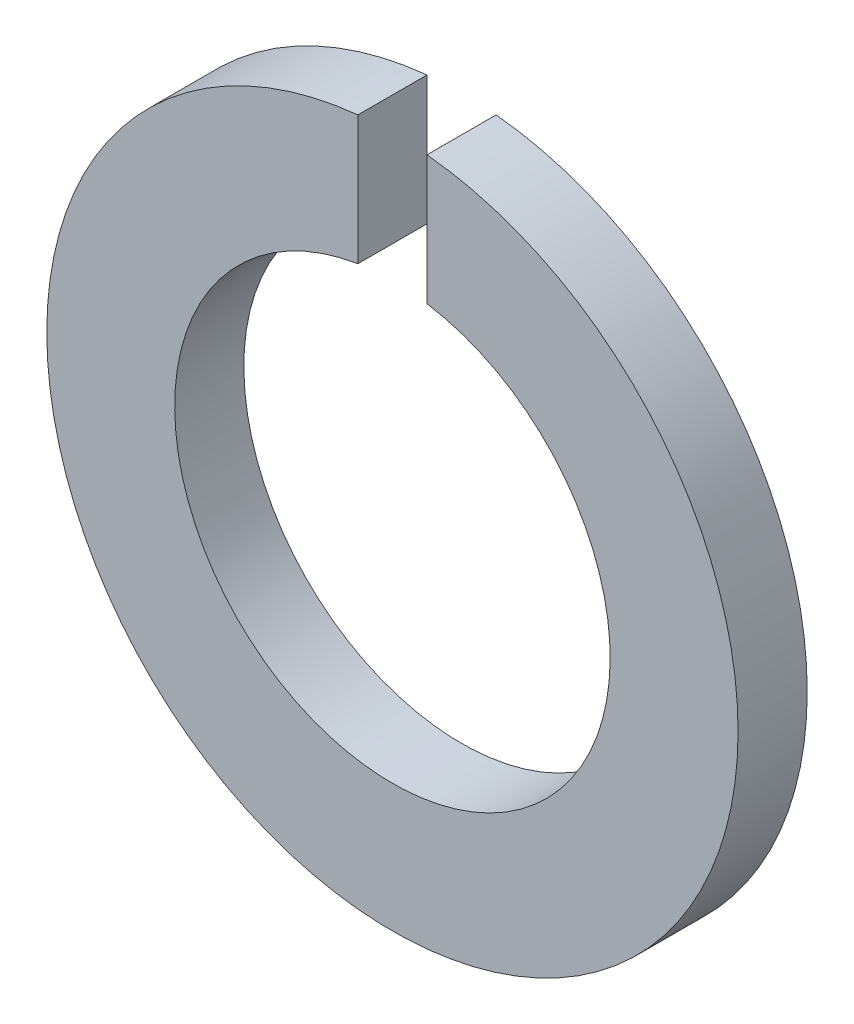
ISO-10303-21;
HEADER;
FILE_DESCRIPTION(('STEP AP214'),'2;1');
FILE_NAME('part.step','',(''),(''),'','','');
FILE_SCHEMA(('AUTOMOTIVE_DESIGN { 1 0 10303 214 1 1 1 1 }'));
ENDSEC;
DATA;
#1=APPLICATION_CONTEXT('core data for automotive mechanical design processes');
#2=APPLICATION_PROTOCOL_DEFINITION('international standard','automotive_design',2000,#1);
#3=PRODUCT_CONTEXT('',#1,'mechanical');
#4=PRODUCT('Part','Part','',(#3));
#5=PRODUCT_RELATED_PRODUCT_CATEGORY('part','',(#4));
#6=PRODUCT_DEFINITION_FORMATION('','',#4);
#7=PRODUCT_DEFINITION_CONTEXT('part definition',#1,'design');
#8=PRODUCT_DEFINITION('design','',#6,#7);
#9=PRODUCT_DEFINITION_SHAPE('','',#8);
#10=(LENGTH_UNIT() NAMED_UNIT(*) SI_UNIT(.MILLI.,.METRE.));
#11=(NAMED_UNIT(*) PLANE_ANGLE_UNIT() SI_UNIT($,.RADIAN.));
#12=(NAMED_UNIT(*) SI_UNIT($,.STERADIAN.) SOLID_ANGLE_UNIT());
#13=UNCERTAINTY_MEASURE_WITH_UNIT(LENGTH_MEASURE(1.E-05),#10,'distance_accuracy_value','');
#14=(GEOMETRIC_REPRESENTATION_CONTEXT(3) GLOBAL_UNCERTAINTY_ASSIGNED_CONTEXT((#13)) GLOBAL_UNIT_ASSIGNED_CONTEXT((#10,
#11,#12)) REPRESENTATION_CONTEXT('',''));
#15=CARTESIAN_POINT('',(0.,0.,0.));
#16=DIRECTION('',(0.,0.,1.));
#17=DIRECTION('',(1.,0.,0.));
#18=AXIS2_PLACEMENT_3D('',#15,#16,#17);
#19=CARTESIAN_POINT('',(0.,0.,0.508));
#20=DIRECTION('',(0.,0.,-1.));
#21=DIRECTION('',(-1.,0.,0.));
#22=AXIS2_PLACEMENT_3D('',#19,#20,#21);
#23=CYLINDRICAL_SURFACE('',#22,1.6);
#24=CARTESIAN_POINT('',(0.,0.,0.));
#25=DIRECTION('',(0.,0.,-1.));
#26=DIRECTION('',(1.,0.,0.));
#27=AXIS2_PLACEMENT_3D('',#24,#25,#26);
#28=CIRCLE('',#27,1.6);
#29=CARTESIAN_POINT('',(0.254,1.5797100999867,0.));
#30=VERTEX_POINT('',#29);
#31=CARTESIAN_POINT('',(-0.254,1.5797100999867,0.));
#32=VERTEX_POINT('',#31);
#33=EDGE_CURVE('E95',#30,#32,#28,.T.);
#34=ORIENTED_EDGE('',*,*,#33,.T.);
#35=DIRECTION('',(0.,0.,-1.));
#36=VECTOR('',#35,1.);
#37=CARTESIAN_POINT('',(-0.254,1.5797100999867,0.508));
#38=LINE('',#37,#36);
#39=CARTESIAN_POINT('',(-0.254,1.5797100999867,0.508));
#40=VERTEX_POINT('',#39);
#41=EDGE_CURVE('E11',#40,#32,#38,.T.);
#42=ORIENTED_EDGE('',*,*,#41,.F.);
#43=CARTESIAN_POINT('',(0.,0.,0.508));
#44=DIRECTION('',(0.,0.,-1.));
#45=DIRECTION('',(1.,0.,0.));
#46=AXIS2_PLACEMENT_3D('',#43,#44,#45);
#47=CIRCLE('',#46,1.6);
#48=CARTESIAN_POINT('',(0.254,1.5797100999867,0.508));
#49=VERTEX_POINT('',#48);
#50=EDGE_CURVE('E83',#49,#40,#47,.T.);
#51=ORIENTED_EDGE('',*,*,#50,.F.);
#52=DIRECTION('',(0.,0.,-1.));
#53=VECTOR('',#52,1.);
#54=CARTESIAN_POINT('',(0.254,1.5797100999867,0.508));
#55=LINE('',#54,#53);
#56=EDGE_CURVE('E91',#49,#30,#55,.T.);
#57=ORIENTED_EDGE('',*,*,#56,.T.);
#58=EDGE_LOOP('',(#34,#42,#51,#57));
#59=FACE_BOUND('',#58,.T.);
#60=ADVANCED_FACE('F32',(#59),#23,.F.);
#61=CARTESIAN_POINT('',(-0.254,2.52726809025082,0.508));
#62=DIRECTION('',(-1.,0.,0.));
#63=DIRECTION('',(0.,-1.,0.));
#64=AXIS2_PLACEMENT_3D('',#61,#62,#63);
#65=PLANE('',#64);
#66=DIRECTION('',(0.,1.,0.));
#67=VECTOR('',#66,1.);
#68=CARTESIAN_POINT('',(-0.254,2.52726809025082,0.));
#69=LINE('',#68,#67);
#70=CARTESIAN_POINT('',(-0.254,2.52726809025082,0.));
#71=VERTEX_POINT('',#70);
#72=EDGE_CURVE('E87',#32,#71,#69,.T.);
#73=ORIENTED_EDGE('',*,*,#72,.T.);
#74=DIRECTION('',(0.,0.,-1.));
#75=VECTOR('',#74,1.);
#76=CARTESIAN_POINT('',(-0.254,2.52726809025082,0.508));
#77=LINE('',#76,#75);
#78=CARTESIAN_POINT('',(-0.254,2.52726809025082,0.508));
#79=VERTEX_POINT('',#78);
#80=EDGE_CURVE('E40',#79,#71,#77,.T.);
#81=ORIENTED_EDGE('',*,*,#80,.F.);
#82=DIRECTION('',(0.,1.,0.));
#83=VECTOR('',#82,1.);
#84=CARTESIAN_POINT('',(-0.254,2.52726809025082,0.508));
#85=LINE('',#84,#83);
#86=EDGE_CURVE('E78',#40,#79,#85,.T.);
#87=ORIENTED_EDGE('',*,*,#86,.F.);
#88=ORIENTED_EDGE('',*,*,#41,.T.);
#89=EDGE_LOOP('',(#73,#81,#87,#88));
#90=FACE_BOUND('',#89,.T.);
#91=ADVANCED_FACE('F86',(#90),#65,.F.);
#92=CARTESIAN_POINT('',(0.,0.,0.508));
#93=DIRECTION('',(0.,0.,-1.));
#94=DIRECTION('',(-1.,0.,0.));
#95=AXIS2_PLACEMENT_3D('',#92,#93,#94);
#96=CYLINDRICAL_SURFACE('',#95,2.54);
#97=CARTESIAN_POINT('',(0.,0.,0.));
#98=DIRECTION('',(0.,0.,1.));
#99=DIRECTION('',(1.,0.,0.));
#100=AXIS2_PLACEMENT_3D('',#97,#98,#99);
#101=CIRCLE('',#100,2.54);
#102=CARTESIAN_POINT('',(0.254,2.52726809025082,0.));
#103=VERTEX_POINT('',#102);
#104=EDGE_CURVE('E65',#71,#103,#101,.T.);
#105=ORIENTED_EDGE('',*,*,#104,.T.);
#106=DIRECTION('',(0.,0.,-1.));
#107=VECTOR('',#106,1.);
#108=CARTESIAN_POINT('',(0.254,2.52726809025082,0.508));
#109=LINE('',#108,#107);
#110=CARTESIAN_POINT('',(0.254,2.52726809025082,0.508));
#111=VERTEX_POINT('',#110);
#112=EDGE_CURVE('E88',#111,#103,#109,.T.);
#113=ORIENTED_EDGE('',*,*,#112,.F.);
#114=CARTESIAN_POINT('',(0.,0.,0.508));
#115=DIRECTION('',(0.,0.,1.));
#116=DIRECTION('',(1.,0.,0.));
#117=AXIS2_PLACEMENT_3D('',#114,#115,#116);
#118=CIRCLE('',#117,2.54);
#119=EDGE_CURVE('E81',#79,#111,#118,.T.);
#120=ORIENTED_EDGE('',*,*,#119,.F.);
#121=ORIENTED_EDGE('',*,*,#80,.T.);
#122=EDGE_LOOP('',(#105,#113,#120,#121));
#123=FACE_BOUND('',#122,.T.);
#124=ADVANCED_FACE('F89',(#123),#96,.T.);
#125=CARTESIAN_POINT('',(0.254,2.52726809025082,0.508));
#126=DIRECTION('',(1.,0.,0.));
#127=DIRECTION('',(0.,1.,0.));
#128=AXIS2_PLACEMENT_3D('',#125,#126,#127);
#129=PLANE('',#128);
#130=DIRECTION('',(0.,-1.,0.));
#131=VECTOR('',#130,1.);
#132=CARTESIAN_POINT('',(0.254,2.52726809025082,0.));
#133=LINE('',#132,#131);
#134=EDGE_CURVE('E71',#103,#30,#133,.T.);
#135=ORIENTED_EDGE('',*,*,#134,.T.);
#136=ORIENTED_EDGE('',*,*,#56,.F.);
#137=DIRECTION('',(0.,-1.,0.));
#138=VECTOR('',#137,1.);
#139=CARTESIAN_POINT('',(0.254,2.52726809025082,0.508));
#140=LINE('',#139,#138);
#141=EDGE_CURVE('E48',#111,#49,#140,.T.);
#142=ORIENTED_EDGE('',*,*,#141,.F.);
#143=ORIENTED_EDGE('',*,*,#112,.T.);
#144=EDGE_LOOP('',(#135,#136,#142,#143));
#145=FACE_BOUND('',#144,.T.);
#146=ADVANCED_FACE('F102',(#145),#129,.F.);
#147=CARTESIAN_POINT('',(0.,0.,0.508));
#148=DIRECTION('',(0.,0.,1.));
#149=DIRECTION('',(1.,0.,0.));
#150=AXIS2_PLACEMENT_3D('',#147,#148,#149);
#151=PLANE('',#150);
#152=ORIENTED_EDGE('',*,*,#50,.T.);
#153=ORIENTED_EDGE('',*,*,#86,.T.);
#154=ORIENTED_EDGE('',*,*,#119,.T.);
#155=ORIENTED_EDGE('',*,*,#141,.T.);
#156=EDGE_LOOP('',(#152,#153,#154,#155));
#157=FACE_BOUND('',#156,.T.);
#158=ADVANCED_FACE('F79',(#157),#151,.T.);
#159=CARTESIAN_POINT('',(0.,0.,0.));
#160=DIRECTION('',(0.,0.,1.));
#161=DIRECTION('',(1.,0.,0.));
#162=AXIS2_PLACEMENT_3D('',#159,#160,#161);
#163=PLANE('',#162);
#164=ORIENTED_EDGE('',*,*,#33,.F.);
#165=ORIENTED_EDGE('',*,*,#134,.F.);
#166=ORIENTED_EDGE('',*,*,#104,.F.);
#167=ORIENTED_EDGE('',*,*,#72,.F.);
#168=EDGE_LOOP('',(#164,#165,#166,#167));
#169=FACE_BOUND('',#168,.T.);
#170=ADVANCED_FACE('F105',(#169),#163,.F.);
#171=CLOSED_SHELL('',(#60,#91,#124,#146,#158,#170));
#172=MANIFOLD_SOLID_BREP('B2',#171);
#173=ADVANCED_BREP_SHAPE_REPRESENTATION('',(#18,#172),#14);
#174=SHAPE_DEFINITION_REPRESENTATION(#9,#173);
ENDSEC;
END-ISO-10303-21;
